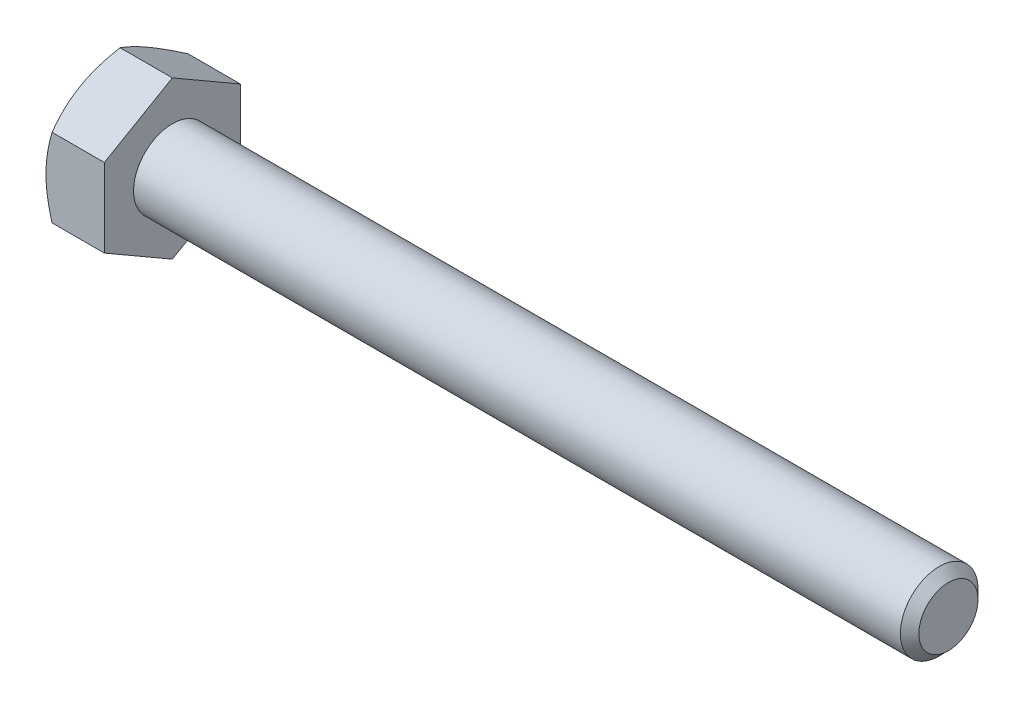
ISO-10303-21;
HEADER;
FILE_DESCRIPTION(('STEP AP214'),'2;1');
FILE_NAME('part.step','',(''),(''),'','','');
FILE_SCHEMA(('AUTOMOTIVE_DESIGN { 1 0 10303 214 1 1 1 1 }'));
ENDSEC;
DATA;
#1=APPLICATION_CONTEXT('core data for automotive mechanical design processes');
#2=APPLICATION_PROTOCOL_DEFINITION('international standard','automotive_design',2000,#1);
#3=PRODUCT_CONTEXT('',#1,'mechanical');
#4=PRODUCT('Part','Part','',(#3));
#5=PRODUCT_RELATED_PRODUCT_CATEGORY('part','',(#4));
#6=PRODUCT_DEFINITION_FORMATION('','',#4);
#7=PRODUCT_DEFINITION_CONTEXT('part definition',#1,'design');
#8=PRODUCT_DEFINITION('design','',#6,#7);
#9=PRODUCT_DEFINITION_SHAPE('','',#8);
#10=(LENGTH_UNIT() NAMED_UNIT(*) SI_UNIT(.MILLI.,.METRE.));
#11=(NAMED_UNIT(*) PLANE_ANGLE_UNIT() SI_UNIT($,.RADIAN.));
#12=(NAMED_UNIT(*) SI_UNIT($,.STERADIAN.) SOLID_ANGLE_UNIT());
#13=UNCERTAINTY_MEASURE_WITH_UNIT(LENGTH_MEASURE(1.E-05),#10,'distance_accuracy_value','');
#14=(GEOMETRIC_REPRESENTATION_CONTEXT(3) GLOBAL_UNCERTAINTY_ASSIGNED_CONTEXT((#13)) GLOBAL_UNIT_ASSIGNED_CONTEXT((#10,
#11,#12)) REPRESENTATION_CONTEXT('',''));
#15=CARTESIAN_POINT('',(0.,0.,0.));
#16=DIRECTION('',(0.,0.,1.));
#17=DIRECTION('',(1.,0.,0.));
#18=AXIS2_PLACEMENT_3D('',#15,#16,#17);
#19=CARTESIAN_POINT('',(4.7752,3.21156860739421,-5.5626));
#20=DIRECTION('',(0.,-0.866025403784438,0.500000000000001));
#21=DIRECTION('',(0.,-0.500000000000002,-0.866025403784438));
#22=AXIS2_PLACEMENT_3D('',#19,#20,#21);
#23=PLANE('',#22);
#24=CARTESIAN_POINT('',(0.496898061070145,6.42325268484227,0.0002));
#25=CARTESIAN_POINT('',(0.456146202255132,6.35265858120791,-0.122072574209491));
#26=CARTESIAN_POINT('',(0.417243775308724,6.2818012683745,-0.244801040124762));
#27=CARTESIAN_POINT('',(0.343647161560544,6.13951120287093,-0.491254662989244));
#28=CARTESIAN_POINT('',(0.308954790139046,6.06807821602766,-0.614980225538198));
#29=CARTESIAN_POINT('',(0.211873701066857,5.8526355064814,-0.988137944592621));
#30=CARTESIAN_POINT('',(0.156654841923374,5.70777535201369,-1.23904309212296));
#31=CARTESIAN_POINT('',(0.0919037861815295,5.49099476252076,-1.61451808721946));
#32=CARTESIAN_POINT('',(0.0734579983429358,5.419722058732,-1.7379660313744));
#33=CARTESIAN_POINT('',(0.0425268916674639,5.27685459691415,-1.98541973399132));
#34=CARTESIAN_POINT('',(0.03004104618901,5.20525986790489,-2.10942544218948));
#35=CARTESIAN_POINT('',(0.0113480299394723,5.06194605565758,-2.35765224642821));
#36=CARTESIAN_POINT('',(0.00513373340584859,4.9902272065059,-2.48187293701928));
#37=CARTESIAN_POINT('',(-0.000889599359094047,4.84672720555796,-2.7304222295473));
#38=CARTESIAN_POINT('',(-0.000698833448294769,4.7749460557547,-2.85475082803225));
#39=CARTESIAN_POINT('',(0.00862810136342433,4.57828637012706,-3.19537539533985));
#40=CARTESIAN_POINT('',(0.0242873955350771,4.4534722013835,-3.41155987710816));
#41=CARTESIAN_POINT('',(0.0739443233816063,4.20467287416474,-3.84249295274001));
#42=CARTESIAN_POINT('',(0.107958931423459,4.08068859075412,-4.05724003094723));
#43=CARTESIAN_POINT('',(0.192986041409677,3.83138850679899,-4.4890404426887));
#44=CARTESIAN_POINT('',(0.244358813937401,3.70610416511176,-4.70603928788379));
#45=CARTESIAN_POINT('',(0.360954456999594,3.45740388365365,-5.13680081122592));
#46=CARTESIAN_POINT('',(0.426149937617058,3.33398475856357,-5.35056900650764));
#47=CARTESIAN_POINT('',(0.496898061070138,3.21145313734037,-5.5628));
#48=B_SPLINE_CURVE_WITH_KNOTS('',3,(#24,#25,#26,#27,#28,#29,#30,#31,#32,#33,#34,#35,#36,#37,#38,
#39,#40,#41,#42,#43,#44,#45,#46,#47),.UNSPECIFIED.,.F.,.F.,(4,2,2,2,2,2,2,2,2,2,2,4),(0.,
0.440820118562271,0.881829648847401,1.76568130465017,2.19678242164486,2.62784543796583,
3.05841812523868,3.48897751176353,4.23854798324166,4.9888128227567,5.75571809391027,
6.52111769989992),.UNSPECIFIED.);
#49=CARTESIAN_POINT('',(0.49683139260579,6.42313721478843,0.));
#50=VERTEX_POINT('',#49);
#51=CARTESIAN_POINT('',(0.,4.81735291109131,-2.78130000000001));
#52=VERTEX_POINT('',#51);
#53=EDGE_CURVE('E47',#50,#52,#48,.T.);
#54=ORIENTED_EDGE('',*,*,#53,.F.);
#55=DIRECTION('',(-1.,0.,0.));
#56=VECTOR('',#55,1.);
#57=CARTESIAN_POINT('',(4.7752,6.42313721478843,0.));
#58=LINE('',#57,#56);
#59=CARTESIAN_POINT('',(4.7752,6.42313721478843,0.));
#60=VERTEX_POINT('',#59);
#61=EDGE_CURVE('E143',#60,#50,#58,.T.);
#62=ORIENTED_EDGE('',*,*,#61,.F.);
#63=DIRECTION('',(0.,0.500000000000001,0.866025403784438));
#64=VECTOR('',#63,1.);
#65=CARTESIAN_POINT('',(4.7752,3.21156860739421,-5.5626));
#66=LINE('',#65,#64);
#67=CARTESIAN_POINT('',(4.7752,3.21156860739421,-5.5626));
#68=VERTEX_POINT('',#67);
#69=EDGE_CURVE('E228',#68,#60,#66,.T.);
#70=ORIENTED_EDGE('',*,*,#69,.F.);
#71=DIRECTION('',(-1.,0.,0.));
#72=VECTOR('',#71,1.);
#73=CARTESIAN_POINT('',(4.7752,3.21156860739421,-5.5626));
#74=LINE('',#73,#72);
#75=CARTESIAN_POINT('',(0.496831392605783,3.21156860739421,-5.5626));
#76=VERTEX_POINT('',#75);
#77=EDGE_CURVE('E131',#68,#76,#74,.T.);
#78=ORIENTED_EDGE('',*,*,#77,.T.);
#79=EDGE_CURVE('E125',#52,#76,#48,.T.);
#80=ORIENTED_EDGE('',*,*,#79,.F.);
#81=EDGE_LOOP('',(#54,#62,#70,#78,#80));
#82=FACE_BOUND('',#81,.T.);
#83=ADVANCED_FACE('F31',(#82),#23,.F.);
#84=CARTESIAN_POINT('',(4.7752,6.42313721478843,0.));
#85=DIRECTION('',(0.,-0.866025403784438,-0.500000000000002));
#86=DIRECTION('',(0.,0.500000000000002,-0.866025403784438));
#87=AXIS2_PLACEMENT_3D('',#84,#85,#86);
#88=PLANE('',#87);
#89=CARTESIAN_POINT('',(0.496898061070137,3.21145313734037,5.5628));
#90=CARTESIAN_POINT('',(0.456146202255125,3.28204724097473,5.44052742579051));
#91=CARTESIAN_POINT('',(0.417243775308718,3.35290455380814,5.31779895987524));
#92=CARTESIAN_POINT('',(0.343647161560539,3.49519461931171,5.07134533701076));
#93=CARTESIAN_POINT('',(0.30895479013904,3.56662760615498,4.9476197744618));
#94=CARTESIAN_POINT('',(0.211873701066851,3.78207031570124,4.57446205540738));
#95=CARTESIAN_POINT('',(0.15665484192337,3.92693047016895,4.32355690787704));
#96=CARTESIAN_POINT('',(0.0919037861815258,4.14371105966188,3.94808191278055));
#97=CARTESIAN_POINT('',(0.0734579983429323,4.21498376345064,3.82463396862561));
#98=CARTESIAN_POINT('',(0.0425268916674611,4.35785122526849,3.57718026600868));
#99=CARTESIAN_POINT('',(0.0300410461890076,4.42944595427775,3.45317455781052));
#100=CARTESIAN_POINT('',(0.0113480299394705,4.57275976652506,3.20494775357179));
#101=CARTESIAN_POINT('',(0.00513373340584691,4.64447861567674,3.08072706298073));
#102=CARTESIAN_POINT('',(-0.000889599359095135,4.78797861662468,2.83217777045271));
#103=CARTESIAN_POINT('',(-0.000698833448295428,4.85975976642794,2.70784917196775));
#104=CARTESIAN_POINT('',(0.00862810136342448,5.05641945205558,2.36722460466016));
#105=CARTESIAN_POINT('',(0.0242873955350775,5.18123362079914,2.15104012289184));
#106=CARTESIAN_POINT('',(0.0739443233816076,5.4300329480179,1.72010704725999));
#107=CARTESIAN_POINT('',(0.107958931423461,5.55401723142852,1.50535996905278));
#108=CARTESIAN_POINT('',(0.192986041409681,5.80331731538366,1.0735595573113));
#109=CARTESIAN_POINT('',(0.244358813937406,5.92860165707088,0.856560712116214));
#110=CARTESIAN_POINT('',(0.360954456999599,6.17730193852899,0.425799188774085));
#111=CARTESIAN_POINT('',(0.426149937617065,6.30072106361907,0.212030993492364));
#112=CARTESIAN_POINT('',(0.496898061070145,6.42325268484227,-0.000200000000000452));
#113=B_SPLINE_CURVE_WITH_KNOTS('',3,(#89,#90,#91,#92,#93,#94,#95,#96,#97,#98,#99,#100,#101,#102,
#103,#104,#105,#106,#107,#108,#109,#110,#111,#112),.UNSPECIFIED.,.F.,.F.,(4,2,2,2,2,2,2,2,2,2,2,
4),(0.,0.440820118562269,0.881829648847399,1.76568130465016,2.19678242164486,2.62784543796583,
3.05841812523867,3.48897751176352,4.23854798324166,4.98881282275669,5.75571809391027,
6.52111769989993),.UNSPECIFIED.);
#114=CARTESIAN_POINT('',(0.496831392605783,3.21156860739421,5.5626));
#115=VERTEX_POINT('',#114);
#116=CARTESIAN_POINT('',(0.,4.81735291109131,2.78130000000001));
#117=VERTEX_POINT('',#116);
#118=EDGE_CURVE('E54',#115,#117,#113,.T.);
#119=ORIENTED_EDGE('',*,*,#118,.F.);
#120=DIRECTION('',(-1.,0.,0.));
#121=VECTOR('',#120,1.);
#122=CARTESIAN_POINT('',(4.7752,3.21156860739421,5.5626));
#123=LINE('',#122,#121);
#124=CARTESIAN_POINT('',(4.7752,3.21156860739421,5.5626));
#125=VERTEX_POINT('',#124);
#126=EDGE_CURVE('E141',#125,#115,#123,.T.);
#127=ORIENTED_EDGE('',*,*,#126,.F.);
#128=DIRECTION('',(0.,-0.500000000000002,0.866025403784438));
#129=VECTOR('',#128,1.);
#130=CARTESIAN_POINT('',(4.7752,6.42313721478843,0.));
#131=LINE('',#130,#129);
#132=EDGE_CURVE('E226',#60,#125,#131,.T.);
#133=ORIENTED_EDGE('',*,*,#132,.F.);
#134=ORIENTED_EDGE('',*,*,#61,.T.);
#135=EDGE_CURVE('E158',#117,#50,#113,.T.);
#136=ORIENTED_EDGE('',*,*,#135,.F.);
#137=EDGE_LOOP('',(#119,#127,#133,#134,#136));
#138=FACE_BOUND('',#137,.T.);
#139=ADVANCED_FACE('F164',(#138),#88,.F.);
#140=CARTESIAN_POINT('',(4.7752,3.21156860739421,5.5626));
#141=DIRECTION('',(0.,0.,-1.));
#142=DIRECTION('',(0.,1.,0.));
#143=AXIS2_PLACEMENT_3D('',#140,#141,#142);
#144=PLANE('',#143);
#145=CARTESIAN_POINT('',(2.76946298118782,-8.73931907134926,5.5626));
#146=CARTESIAN_POINT('',(2.65067477687311,-8.49536496294496,5.5626));
#147=CARTESIAN_POINT('',(2.53299354297042,-8.25086273134791,5.5626));
#148=CARTESIAN_POINT('',(2.30046552320843,-7.7604708971534,5.5626));
#149=CARTESIAN_POINT('',(2.18561916316987,-7.51458109286489,5.5626));
#150=CARTESIAN_POINT('',(1.95882765602869,-7.01990967591007,5.5626));
#151=CARTESIAN_POINT('',(1.8469007539214,-6.77111967039446,5.5626));
#152=CARTESIAN_POINT('',(1.62748022369642,-6.2715995272068,5.5626));
#153=CARTESIAN_POINT('',(1.51998639326666,-6.02086947869407,5.5626));
#154=CARTESIAN_POINT('',(1.30708686305049,-5.50862062515995,5.5626));
#155=CARTESIAN_POINT('',(1.2018721345633,-5.24702202730584,5.5626));
#156=CARTESIAN_POINT('',(0.999136458565238,-4.72080610690395,5.5626));
#157=CARTESIAN_POINT('',(0.901616358276672,-4.45618845560251,5.5626));
#158=CARTESIAN_POINT('',(0.716747076854938,-3.92397402586807,5.5626));
#159=CARTESIAN_POINT('',(0.629378259627776,-3.65638413416904,5.5626));
#160=CARTESIAN_POINT('',(0.467540995367502,-3.11736467394692,5.5626));
#161=CARTESIAN_POINT('',(0.393068603844484,-2.84593630702823,5.5626));
#162=CARTESIAN_POINT('',(0.260913640576687,-2.30059524037529,5.5626));
#163=CARTESIAN_POINT('',(0.203137923933969,-2.02670547196029,5.5626));
#164=CARTESIAN_POINT('',(0.107584140993962,-1.47536640605574,5.5626));
#165=CARTESIAN_POINT('',(0.0698039298235405,-1.19791749361908,5.5626));
#166=CARTESIAN_POINT('',(0.0306329033129829,-0.782024037078651,5.5626));
#167=CARTESIAN_POINT('',(0.0205033244370687,-0.644369603517899,5.5626));
#168=CARTESIAN_POINT('',(0.0060753924948423,-0.368760084714098,5.5626));
#169=CARTESIAN_POINT('',(0.00177648780683643,-0.230805029148983,5.5626));
#170=CARTESIAN_POINT('',(-0.00088241598890318,0.0451740110860491,5.5626));
#171=CARTESIAN_POINT('',(0.000758104200529116,0.183198000728104,5.5626));
#172=CARTESIAN_POINT('',(0.00993570123351545,0.459040077970908,5.5626));
#173=CARTESIAN_POINT('',(0.0174725517322426,0.596858173271942,5.5626));
#174=CARTESIAN_POINT('',(0.0422505226941699,0.924672766545149,5.5626));
#175=CARTESIAN_POINT('',(0.0620998981240967,1.11447655015001,5.5626));
#176=CARTESIAN_POINT('',(0.111925243451362,1.49274005777643,5.5626));
#177=CARTESIAN_POINT('',(0.141902492996073,1.68119960888146,5.5626));
#178=CARTESIAN_POINT('',(0.245441794558736,2.24430469004824,5.5626));
#179=CARTESIAN_POINT('',(0.3325951814541,2.61648783903803,5.5626));
#180=CARTESIAN_POINT('',(0.4845806566888,3.17327423069249,5.5626));
#181=CARTESIAN_POINT('',(0.539535147458612,3.36074033845109,5.5626));
#182=CARTESIAN_POINT('',(0.65536185695369,3.73385345225387,5.5626));
#183=CARTESIAN_POINT('',(0.716234120687406,3.91950044445069,5.5626));
#184=CARTESIAN_POINT('',(0.842902268347435,4.28903173945152,5.5626));
#185=CARTESIAN_POINT('',(0.908696733188397,4.47291653318727,5.5626));
#186=CARTESIAN_POINT('',(1.04441413237549,4.83914664715104,5.5626));
#187=CARTESIAN_POINT('',(1.11433697604312,5.02149200109189,5.5626));
#188=CARTESIAN_POINT('',(1.30616254116174,5.5078879993683,5.5626));
#189=CARTESIAN_POINT('',(1.43118964217263,5.81070521732177,5.5626));
#190=CARTESIAN_POINT('',(1.68847909791363,6.41326146392027,5.5626));
#191=CARTESIAN_POINT('',(1.82074222334613,6.7130001606208,5.5626));
#192=CARTESIAN_POINT('',(2.09080854329268,7.31009692856944,5.5626));
#193=CARTESIAN_POINT('',(2.22861377416229,7.60745407573435,5.5626));
#194=CARTESIAN_POINT('',(2.50845292532567,8.20015103027085,5.5626));
#195=CARTESIAN_POINT('',(2.65048668069894,8.4954909157686,5.5626));
#196=CARTESIAN_POINT('',(2.93809441051761,9.08501121024942,5.5626));
#197=CARTESIAN_POINT('',(3.08367358024025,9.37918907947537,5.5626));
#198=CARTESIAN_POINT('',(3.3774807874048,9.96621951539326,5.5626));
#199=CARTESIAN_POINT('',(3.52570884593012,10.2590720715133,5.5626));
#200=CARTESIAN_POINT('',(3.97349977739061,11.135883002068,5.5626));
#201=CARTESIAN_POINT('',(4.27623214013078,11.7182219913801,5.5626));
#202=CARTESIAN_POINT('',(4.85550678061973,12.8193647778852,5.5626));
#203=CARTESIAN_POINT('',(5.131489866857,13.3384641726992,5.5626));
#204=CARTESIAN_POINT('',(5.68680572725548,14.3749069841369,5.5626));
#205=CARTESIAN_POINT('',(5.96613869990832,14.8922502943533,5.5626));
#206=CARTESIAN_POINT('',(6.52636532569115,15.9238879354022,5.5626));
#207=CARTESIAN_POINT('',(6.80725082971984,16.438186698545,5.5626));
#208=CARTESIAN_POINT('',(7.37092859091901,17.4656872159849,5.5626));
#209=CARTESIAN_POINT('',(7.65372069975336,17.9788890516247,5.5626));
#210=CARTESIAN_POINT('',(7.93720779447483,18.4917042756102,5.5626));
#211=B_SPLINE_CURVE_WITH_KNOTS('',3,(#145,#146,#147,#148,#149,#150,#151,#152,#153,#154,#155,
#156,#157,#158,#159,#160,#161,#162,#163,#164,#165,#166,#167,#168,#169,#170,#171,#172,#173,#174,
#175,#176,#177,#178,#179,#180,#181,#182,#183,#184,#185,#186,#187,#188,#189,#190,#191,#192,#193,
#194,#195,#196,#197,#198,#199,#200,#201,#202,#203,#204,#205,#206,#207,#208,#209,#210),
.UNSPECIFIED.,.F.,.F.,(4,2,2,2,2,2,2,2,2,2,2,2,2,2,2,2,2,2,2,2,2,2,2,2,2,2,2,2,2,2,2,2,4),(0.,
0.814023059457575,1.62816765666496,2.44655638570204,3.26490772451191,4.1107076400708,
4.95660055342857,5.80082897227975,6.64479871831149,7.4839651145243,8.32304147698214,
8.73701667946676,9.15095271433074,9.56492494141957,9.97888127796806,10.5510771655991,
11.1233453766966,12.2684477407956,12.8544603586944,13.4404774339429,14.0263262050101,
14.6121621128824,15.5948602729038,16.577663303757,17.5608308091096,18.5439600191606,
19.5286286861599,20.5133051939663,22.4822323595086,24.2459312012703,26.0097350693916,
27.7677407284946,29.5256111556824),.UNSPECIFIED.);
#212=CARTESIAN_POINT('',(0.496831392605776,-3.21156860739418,5.5626));
#213=VERTEX_POINT('',#212);
#214=CARTESIAN_POINT('',(0.,0.,5.5626));
#215=VERTEX_POINT('',#214);
#216=EDGE_CURVE('E238',#213,#215,#211,.T.);
#217=ORIENTED_EDGE('',*,*,#216,.F.);
#218=DIRECTION('',(-1.,0.,0.));
#219=VECTOR('',#218,1.);
#220=CARTESIAN_POINT('',(4.7752,-3.21156860739418,5.5626));
#221=LINE('',#220,#219);
#222=CARTESIAN_POINT('',(4.7752,-3.21156860739418,5.5626));
#223=VERTEX_POINT('',#222);
#224=EDGE_CURVE('E133',#223,#213,#221,.T.);
#225=ORIENTED_EDGE('',*,*,#224,.F.);
#226=DIRECTION('',(0.,-1.,0.));
#227=VECTOR('',#226,1.);
#228=CARTESIAN_POINT('',(4.7752,3.21156860739421,5.5626));
#229=LINE('',#228,#227);
#230=EDGE_CURVE('E222',#125,#223,#229,.T.);
#231=ORIENTED_EDGE('',*,*,#230,.F.);
#232=ORIENTED_EDGE('',*,*,#126,.T.);
#233=EDGE_CURVE('E180',#215,#115,#211,.T.);
#234=ORIENTED_EDGE('',*,*,#233,.F.);
#235=EDGE_LOOP('',(#217,#225,#231,#232,#234));
#236=FACE_BOUND('',#235,.T.);
#237=ADVANCED_FACE('F244',(#236),#144,.F.);
#238=CARTESIAN_POINT('',(4.7752,-6.42313721478841,0.));
#239=DIRECTION('',(0.,0.866025403784438,-0.500000000000002));
#240=DIRECTION('',(0.,0.500000000000002,0.866025403784438));
#241=AXIS2_PLACEMENT_3D('',#238,#239,#240);
#242=PLANE('',#241);
#243=CARTESIAN_POINT('',(0.496898061070133,-6.42325268484225,-0.000200000000000067));
#244=CARTESIAN_POINT('',(0.45614620225512,-6.35265858120789,0.12207257420949));
#245=CARTESIAN_POINT('',(0.417243775308713,-6.28180126837448,0.244801040124761));
#246=CARTESIAN_POINT('',(0.343647161560533,-6.13951120287091,0.491254662989242));
#247=CARTESIAN_POINT('',(0.308954790139034,-6.06807821602764,0.614980225538195));
#248=CARTESIAN_POINT('',(0.211873701066845,-5.85263550648138,0.988137944592617));
#249=CARTESIAN_POINT('',(0.156654841923363,-5.70777535201367,1.23904309212296));
#250=CARTESIAN_POINT('',(0.0919037861815182,-5.49099476252074,1.61451808721945));
#251=CARTESIAN_POINT('',(0.0734579983429243,-5.41972205873198,1.73796603137439));
#252=CARTESIAN_POINT('',(0.0425268916674522,-5.27685459691413,1.98541973399131));
#253=CARTESIAN_POINT('',(0.0300410461889981,-5.20525986790487,2.10942544218947));
#254=CARTESIAN_POINT('',(0.0113480299394605,-5.06194605565756,2.3576522464282));
#255=CARTESIAN_POINT('',(0.00513373340583685,-4.99022720650589,2.48187293701927));
#256=CARTESIAN_POINT('',(-0.000889599359105341,-4.84672720555794,2.73042222954729));
#257=CARTESIAN_POINT('',(-0.000698833448305768,-4.77494605575468,2.85475082803224));
#258=CARTESIAN_POINT('',(0.00862810136341335,-4.57828637012704,3.19537539533984));
#259=CARTESIAN_POINT('',(0.0242873955350654,-4.45347220138349,3.41155987710815));
#260=CARTESIAN_POINT('',(0.0739443233815945,-4.20467287416472,3.84249295274001));
#261=CARTESIAN_POINT('',(0.107958931423448,-4.0806885907541,4.05724003094722));
#262=CARTESIAN_POINT('',(0.192986041409668,-3.83138850679897,4.48904044268869));
#263=CARTESIAN_POINT('',(0.244358813937392,-3.70610416511174,4.70603928788378));
#264=CARTESIAN_POINT('',(0.360954456999586,-3.45740388365363,5.13680081122591));
#265=CARTESIAN_POINT('',(0.426149937617051,-3.33398475856355,5.35056900650764));
#266=CARTESIAN_POINT('',(0.49689806107013,-3.21145313734035,5.5628));
#267=B_SPLINE_CURVE_WITH_KNOTS('',3,(#243,#244,#245,#246,#247,#248,#249,#250,#251,#252,#253,
#254,#255,#256,#257,#258,#259,#260,#261,#262,#263,#264,#265,#266),.UNSPECIFIED.,.F.,.F.,(4,2,2,
2,2,2,2,2,2,2,2,4),(0.,0.440820118562269,0.881829648847397,1.76568130465016,2.19678242164486,
2.62784543796582,3.05841812523867,3.48897751176352,4.23854798324165,4.98881282275669,
5.75571809391027,6.52111769989993),.UNSPECIFIED.);
#268=CARTESIAN_POINT('',(0.496831392605778,-6.42313721478841,0.));
#269=VERTEX_POINT('',#268);
#270=CARTESIAN_POINT('',(0.,-4.81735291109131,2.78130000000001));
#271=VERTEX_POINT('',#270);
#272=EDGE_CURVE('E166',#269,#271,#267,.T.);
#273=ORIENTED_EDGE('',*,*,#272,.F.);
#274=DIRECTION('',(-1.,0.,0.));
#275=VECTOR('',#274,1.);
#276=CARTESIAN_POINT('',(4.7752,-6.42313721478841,0.));
#277=LINE('',#276,#275);
#278=CARTESIAN_POINT('',(4.7752,-6.42313721478841,0.));
#279=VERTEX_POINT('',#278);
#280=EDGE_CURVE('E130',#279,#269,#277,.T.);
#281=ORIENTED_EDGE('',*,*,#280,.F.);
#282=DIRECTION('',(0.,-0.500000000000002,-0.866025403784438));
#283=VECTOR('',#282,1.);
#284=CARTESIAN_POINT('',(4.7752,-6.42313721478841,0.));
#285=LINE('',#284,#283);
#286=EDGE_CURVE('E220',#223,#279,#285,.T.);
#287=ORIENTED_EDGE('',*,*,#286,.F.);
#288=ORIENTED_EDGE('',*,*,#224,.T.);
#289=EDGE_CURVE('E168',#271,#213,#267,.T.);
#290=ORIENTED_EDGE('',*,*,#289,.F.);
#291=EDGE_LOOP('',(#273,#281,#287,#288,#290));
#292=FACE_BOUND('',#291,.T.);
#293=ADVANCED_FACE('F216',(#292),#242,.F.);
#294=CARTESIAN_POINT('',(4.7752,-3.21156860739421,-5.5626));
#295=DIRECTION('',(0.,0.866025403784439,0.499999999999999));
#296=DIRECTION('',(0.,-0.499999999999999,0.866025403784439));
#297=AXIS2_PLACEMENT_3D('',#294,#295,#296);
#298=PLANE('',#297);
#299=CARTESIAN_POINT('',(0.496898061070139,-3.21145313734037,-5.5628));
#300=CARTESIAN_POINT('',(0.456146202255127,-3.28204724097473,-5.44052742579051));
#301=CARTESIAN_POINT('',(0.417243775308719,-3.35290455380814,-5.31779895987524));
#302=CARTESIAN_POINT('',(0.343647161560539,-3.49519461931171,-5.07134533701076));
#303=CARTESIAN_POINT('',(0.30895479013904,-3.56662760615499,-4.9476197744618));
#304=CARTESIAN_POINT('',(0.211873701066851,-3.78207031570124,-4.57446205540738));
#305=CARTESIAN_POINT('',(0.15665484192337,-3.92693047016895,-4.32355690787704));
#306=CARTESIAN_POINT('',(0.0919037861815247,-4.14371105966188,-3.94808191278054));
#307=CARTESIAN_POINT('',(0.0734579983429302,-4.21498376345064,-3.8246339686256));
#308=CARTESIAN_POINT('',(0.0425268916674584,-4.35785122526849,-3.57718026600868));
#309=CARTESIAN_POINT('',(0.0300410461890051,-4.42944595427775,-3.45317455781052));
#310=CARTESIAN_POINT('',(0.0113480299394679,-4.57275976652506,-3.20494775357179));
#311=CARTESIAN_POINT('',(0.00513373340584384,-4.64447861567673,-3.08072706298072));
#312=CARTESIAN_POINT('',(-0.000889599359098822,-4.78797861662468,-2.8321777704527));
#313=CARTESIAN_POINT('',(-0.00069883344829927,-4.85975976642793,-2.70784917196775));
#314=CARTESIAN_POINT('',(0.00862810136342017,-5.05641945205557,-2.36722460466015));
#315=CARTESIAN_POINT('',(0.0242873955350727,-5.18123362079913,-2.15104012289184));
#316=CARTESIAN_POINT('',(0.073944323381602,-5.43003294801789,-1.72010704725998));
#317=CARTESIAN_POINT('',(0.107958931423455,-5.55401723142851,-1.50535996905277));
#318=CARTESIAN_POINT('',(0.192986041409674,-5.80331731538364,-1.0735595573113));
#319=CARTESIAN_POINT('',(0.244358813937398,-5.92860165707086,-0.856560712116212));
#320=CARTESIAN_POINT('',(0.36095445699959,-6.17730193852897,-0.425799188774083));
#321=CARTESIAN_POINT('',(0.426149937617054,-6.30072106361906,-0.212030993492363));
#322=CARTESIAN_POINT('',(0.496898061070133,-6.42325268484225,0.000200000000000195));
#323=B_SPLINE_CURVE_WITH_KNOTS('',3,(#299,#300,#301,#302,#303,#304,#305,#306,#307,#308,#309,
#310,#311,#312,#313,#314,#315,#316,#317,#318,#319,#320,#321,#322),.UNSPECIFIED.,.F.,.F.,(4,2,2,
2,2,2,2,2,2,2,2,4),(0.,0.44082011856227,0.881829648847399,1.76568130465016,2.19678242164486,
2.62784543796583,3.05841812523868,3.48897751176352,4.23854798324166,4.98881282275669,
5.75571809391027,6.52111769989992),.UNSPECIFIED.);
#324=CARTESIAN_POINT('',(0.496831392605575,-3.21156860739453,-5.5626));
#325=VERTEX_POINT('',#324);
#326=CARTESIAN_POINT('',(0.,-4.81735291109132,-2.78129999999999));
#327=VERTEX_POINT('',#326);
#328=EDGE_CURVE('E107',#325,#327,#323,.T.);
#329=ORIENTED_EDGE('',*,*,#328,.F.);
#330=DIRECTION('',(-1.,0.,0.));
#331=VECTOR('',#330,1.);
#332=CARTESIAN_POINT('',(4.7752,-3.21156860739421,-5.5626));
#333=LINE('',#332,#331);
#334=CARTESIAN_POINT('',(4.7752,-3.21156860739421,-5.5626));
#335=VERTEX_POINT('',#334);
#336=EDGE_CURVE('E121',#335,#325,#333,.T.);
#337=ORIENTED_EDGE('',*,*,#336,.F.);
#338=DIRECTION('',(0.,0.499999999999999,-0.866025403784439));
#339=VECTOR('',#338,1.);
#340=CARTESIAN_POINT('',(4.7752,-3.21156860739421,-5.5626));
#341=LINE('',#340,#339);
#342=EDGE_CURVE('E218',#279,#335,#341,.T.);
#343=ORIENTED_EDGE('',*,*,#342,.F.);
#344=ORIENTED_EDGE('',*,*,#280,.T.);
#345=EDGE_CURVE('E124',#327,#269,#323,.T.);
#346=ORIENTED_EDGE('',*,*,#345,.F.);
#347=EDGE_LOOP('',(#329,#337,#343,#344,#346));
#348=FACE_BOUND('',#347,.T.);
#349=ADVANCED_FACE('F119',(#348),#298,.F.);
#350=CARTESIAN_POINT('',(4.7752,3.21156860739421,-5.5626));
#351=DIRECTION('',(0.,0.,1.));
#352=DIRECTION('',(0.,-1.,0.));
#353=AXIS2_PLACEMENT_3D('',#350,#351,#352);
#354=PLANE('',#353);
#355=CARTESIAN_POINT('',(2.76946298300579,-8.73931907508182,-5.5626));
#356=CARTESIAN_POINT('',(2.65067477861528,-8.49536496655187,-5.5626));
#357=CARTESIAN_POINT('',(2.53299354463683,-8.25086273482909,-5.5626));
#358=CARTESIAN_POINT('',(2.30046552472368,-7.76047090038272,-5.5626));
#359=CARTESIAN_POINT('',(2.18561916460972,-7.51458109596809,-5.5626));
#360=CARTESIAN_POINT('',(1.95882765731771,-7.01990967875913,-5.5626));
#361=CARTESIAN_POINT('',(1.846900755135,-6.77111967311548,-5.5626));
#362=CARTESIAN_POINT('',(1.62748022476042,-6.27159952967088,-5.5626));
#363=CARTESIAN_POINT('',(1.51998639425648,-6.02086948102925,-5.5626));
#364=CARTESIAN_POINT('',(1.30708686388975,-5.50862062722724,-5.5626));
#365=CARTESIAN_POINT('',(1.20187213532635,-5.24702202923405,-5.5626));
#366=CARTESIAN_POINT('',(0.99913645917992,-4.72080610855178,-5.5626));
#367=CARTESIAN_POINT('',(0.901616358819191,-4.45618845710904,-5.5626));
#368=CARTESIAN_POINT('',(0.716747077259988,-3.92397402708937,-5.5626));
#369=CARTESIAN_POINT('',(0.629378259967501,-3.65638413524644,-5.5626));
#370=CARTESIAN_POINT('',(0.467540995587167,-3.11736467473259,-5.5626));
#371=CARTESIAN_POINT('',(0.393068604009408,-2.84593630766609,-5.5626));
#372=CARTESIAN_POINT('',(0.260913640631061,-2.3005952406421,-5.5626));
#373=CARTESIAN_POINT('',(0.203137923936715,-2.02670547200285,-5.5626));
#374=CARTESIAN_POINT('',(0.107584140927261,-1.47536640564425,-5.5626));
#375=CARTESIAN_POINT('',(0.0698039297389958,-1.19791749297779,-5.5626));
#376=CARTESIAN_POINT('',(0.0306329032322217,-0.782024036094227,-5.5626));
#377=CARTESIAN_POINT('',(0.0205033243625259,-0.644369602420758,-5.5626));
#378=CARTESIAN_POINT('',(0.00607539244269881,-0.368760083391737,-5.5626));
#379=CARTESIAN_POINT('',(0.00177648777087203,-0.230805027714118,-5.5626));
#380=CARTESIAN_POINT('',(-0.000882415982739008,0.0451740127451212,-5.5626));
#381=CARTESIAN_POINT('',(0.000758104232646094,0.183198002498879,-5.5626));
#382=CARTESIAN_POINT('',(0.00993570132662366,0.459040079963616,-5.5626));
#383=CARTESIAN_POINT('',(0.0174725518603885,0.596858175374882,-5.5626));
#384=CARTESIAN_POINT('',(0.042250522908457,0.924672768817533,-5.5626));
#385=CARTESIAN_POINT('',(0.062099898387905,1.11447655248113,-5.5626));
#386=CARTESIAN_POINT('',(0.11192524381685,1.49274006022233,-5.5626));
#387=CARTESIAN_POINT('',(0.14190249341372,1.68119961138341,-5.5626));
#388=CARTESIAN_POINT('',(0.245441795133937,2.24430469271527,-5.5626));
#389=CARTESIAN_POINT('',(0.332595182135703,2.61648784181074,-5.5626));
#390=CARTESIAN_POINT('',(0.484580657527371,3.17327423362326,-5.5626));
#391=CARTESIAN_POINT('',(0.539535148349866,3.36074034143568,-5.5626));
#392=CARTESIAN_POINT('',(0.65536185794868,3.73385345534551,-5.5626));
#393=CARTESIAN_POINT('',(0.71623412173345,3.91950044759555,-5.5626));
#394=CARTESIAN_POINT('',(0.842902269493737,4.28903174270241,-5.5626));
#395=CARTESIAN_POINT('',(0.908696734383901,4.47291653649097,-5.5626));
#396=CARTESIAN_POINT('',(1.04441413366767,4.83914665056039,-5.5626));
#397=CARTESIAN_POINT('',(1.11433697738277,5.02149200455406,-5.5626));
#398=CARTESIAN_POINT('',(1.30616254258248,5.5078880028608,-5.5626));
#399=CARTESIAN_POINT('',(1.43118964362202,5.8107052207933,-5.5626));
#400=CARTESIAN_POINT('',(1.68847909941208,6.41326146735255,-5.5626));
#401=CARTESIAN_POINT('',(1.82074222486501,6.71300016403479,-5.5626));
#402=CARTESIAN_POINT('',(2.09080854484644,7.31009693194882,-5.5626));
#403=CARTESIAN_POINT('',(2.22861377573049,7.60745407909739,-5.5626));
#404=CARTESIAN_POINT('',(2.50845292691854,8.20015103360299,-5.5626));
#405=CARTESIAN_POINT('',(2.65048668230202,8.49549091908616,-5.5626));
#406=CARTESIAN_POINT('',(2.93809441213761,9.08501121353829,-5.5626));
#407=CARTESIAN_POINT('',(3.08367358186692,9.37918908275012,-5.5626));
#408=CARTESIAN_POINT('',(3.37748078904248,9.96621951864084,-5.5626));
#409=CARTESIAN_POINT('',(3.52570884757214,10.2590720747479,-5.5626));
#410=CARTESIAN_POINT('',(3.97349977904316,11.1358830052649,-5.5626));
#411=CARTESIAN_POINT('',(4.27623214178692,11.7182219945536,-5.5626));
#412=CARTESIAN_POINT('',(4.85550678228881,12.8193647810355,-5.5626));
#413=CARTESIAN_POINT('',(5.13148986853601,13.3384641758492,-5.5626));
#414=CARTESIAN_POINT('',(5.68680572895232,14.3749069872875,-5.5626));
#415=CARTESIAN_POINT('',(5.96613870161306,14.8922502975047,-5.5626));
#416=CARTESIAN_POINT('',(6.52636532741208,15.9238879385591,-5.5626));
#417=CARTESIAN_POINT('',(6.80725083144907,16.4381867017065,-5.5626));
#418=CARTESIAN_POINT('',(7.37092859266394,17.4656872191565,-5.5626));
#419=CARTESIAN_POINT('',(7.65372070150567,17.9788890548015,-5.5626));
#420=CARTESIAN_POINT('',(7.93720779623423,18.4917042787924,-5.5626));
#421=B_SPLINE_CURVE_WITH_KNOTS('',3,(#355,#356,#357,#358,#359,#360,#361,#362,#363,#364,#365,
#366,#367,#368,#369,#370,#371,#372,#373,#374,#375,#376,#377,#378,#379,#380,#381,#382,#383,#384,
#385,#386,#387,#388,#389,#390,#391,#392,#393,#394,#395,#396,#397,#398,#399,#400,#401,#402,#403,
#404,#405,#406,#407,#408,#409,#410,#411,#412,#413,#414,#415,#416,#417,#418,#419,#420),
.UNSPECIFIED.,.F.,.F.,(4,2,2,2,2,2,2,2,2,2,2,2,2,2,2,2,2,2,2,2,2,2,2,2,2,2,2,2,2,2,2,2,4),(0.,
0.814023059896039,1.62816765754195,2.44655638702216,3.26490772627512,4.11070764230638,
4.95660055613668,5.80082897545884,6.6447987219612,7.48396511886283,8.32304148200849,
8.7370166848287,9.15095272002818,9.56492494745272,9.97888128433687,10.5510771721585,
11.1233453834466,12.2684477479276,12.8544603660259,13.4404774414739,14.0263262127401,
14.6121621208114,15.5948602808078,16.5776633116356,17.5608308169621,18.5439600269871,
19.5286286939573,20.5133052017346,22.4822323672198,24.245931208995,26.0097350771296,
27.7677407362569,29.5256111634693),.UNSPECIFIED.);
#422=CARTESIAN_POINT('',(0.,0.,-5.5626));
#423=VERTEX_POINT('',#422);
#424=EDGE_CURVE('E113',#76,#423,#421,.F.);
#425=ORIENTED_EDGE('',*,*,#424,.F.);
#426=ORIENTED_EDGE('',*,*,#77,.F.);
#427=DIRECTION('',(0.,1.,0.));
#428=VECTOR('',#427,1.);
#429=CARTESIAN_POINT('',(4.7752,3.21156860739421,-5.5626));
#430=LINE('',#429,#428);
#431=EDGE_CURVE('E129',#335,#68,#430,.T.);
#432=ORIENTED_EDGE('',*,*,#431,.F.);
#433=ORIENTED_EDGE('',*,*,#336,.T.);
#434=EDGE_CURVE('E104',#423,#325,#421,.F.);
#435=ORIENTED_EDGE('',*,*,#434,.F.);
#436=EDGE_LOOP('',(#425,#426,#432,#433,#435));
#437=FACE_BOUND('',#436,.T.);
#438=ADVANCED_FACE('F127',(#437),#354,.F.);
#439=CARTESIAN_POINT('',(4.7752,6.42313721478843,0.));
#440=DIRECTION('',(1.,0.,0.));
#441=DIRECTION('',(0.,0.,-1.));
#442=AXIS2_PLACEMENT_3D('',#439,#440,#441);
#443=PLANE('',#442);
#444=ORIENTED_EDGE('',*,*,#69,.T.);
#445=ORIENTED_EDGE('',*,*,#132,.T.);
#446=ORIENTED_EDGE('',*,*,#230,.T.);
#447=ORIENTED_EDGE('',*,*,#286,.T.);
#448=ORIENTED_EDGE('',*,*,#342,.T.);
#449=ORIENTED_EDGE('',*,*,#431,.T.);
#450=EDGE_LOOP('',(#444,#445,#446,#447,#448,#449));
#451=FACE_BOUND('',#450,.T.);
#452=CARTESIAN_POINT('',(4.7752,0.,0.));
#453=DIRECTION('',(1.,0.,0.));
#454=DIRECTION('',(0.,0.,-1.));
#455=AXIS2_PLACEMENT_3D('',#452,#453,#454);
#456=CIRCLE('',#455,3.175);
#457=CARTESIAN_POINT('',(4.7752,0.,-3.175));
#458=VERTEX_POINT('',#457);
#459=EDGE_CURVE('E231',#458,#458,#456,.F.);
#460=ORIENTED_EDGE('',*,*,#459,.T.);
#461=EDGE_LOOP('',(#460));
#462=FACE_BOUND('',#461,.T.);
#463=ADVANCED_FACE('F246',(#451,#462),#443,.T.);
#464=CARTESIAN_POINT('',(0.,0.,0.));
#465=DIRECTION('',(-1.,0.,0.));
#466=DIRECTION('',(0.,0.,1.));
#467=AXIS2_PLACEMENT_3D('',#464,#465,#466);
#468=CYLINDRICAL_SURFACE('',#467,3.175);
#469=ORIENTED_EDGE('',*,*,#459,.F.);
#470=EDGE_LOOP('',(#469));
#471=FACE_BOUND('',#470,.T.);
#472=CARTESIAN_POINT('',(67.51955,0.,0.));
#473=DIRECTION('',(-1.,0.,0.));
#474=DIRECTION('',(0.,0.,1.));
#475=AXIS2_PLACEMENT_3D('',#472,#473,#474);
#476=CIRCLE('',#475,3.175);
#477=CARTESIAN_POINT('',(67.51955,0.,3.175));
#478=VERTEX_POINT('',#477);
#479=EDGE_CURVE('E234',#478,#478,#476,.T.);
#480=ORIENTED_EDGE('',*,*,#479,.T.);
#481=EDGE_LOOP('',(#480));
#482=FACE_BOUND('',#481,.T.);
#483=ADVANCED_FACE('F278',(#471,#482),#468,.T.);
#484=CARTESIAN_POINT('',(68.2752,0.,0.));
#485=DIRECTION('',(-1.,0.,0.));
#486=DIRECTION('',(0.,0.,1.));
#487=AXIS2_PLACEMENT_3D('',#484,#485,#486);
#488=CONICAL_SURFACE('',#487,2.41935,0.785398163397432);
#489=ORIENTED_EDGE('',*,*,#479,.F.);
#490=EDGE_LOOP('',(#489));
#491=FACE_BOUND('',#490,.T.);
#492=CARTESIAN_POINT('',(68.2752,0.,0.));
#493=DIRECTION('',(-1.,0.,0.));
#494=DIRECTION('',(0.,0.,1.));
#495=AXIS2_PLACEMENT_3D('',#492,#493,#494);
#496=CIRCLE('',#495,2.41935);
#497=CARTESIAN_POINT('',(68.2752,0.,2.41935));
#498=VERTEX_POINT('',#497);
#499=EDGE_CURVE('E236',#498,#498,#496,.T.);
#500=ORIENTED_EDGE('',*,*,#499,.T.);
#501=EDGE_LOOP('',(#500));
#502=FACE_BOUND('',#501,.T.);
#503=ADVANCED_FACE('F280',(#491,#502),#488,.T.);
#504=CARTESIAN_POINT('',(68.2752,0.,0.));
#505=DIRECTION('',(-1.,0.,0.));
#506=DIRECTION('',(0.,0.,1.));
#507=AXIS2_PLACEMENT_3D('',#504,#505,#506);
#508=PLANE('',#507);
#509=ORIENTED_EDGE('',*,*,#499,.F.);
#510=EDGE_LOOP('',(#509));
#511=FACE_BOUND('',#510,.T.);
#512=ADVANCED_FACE('F193',(#511),#508,.F.);
#513=CARTESIAN_POINT('',(0.,0.,0.));
#514=DIRECTION('',(1.,0.,0.));
#515=DIRECTION('',(0.,0.,-1.));
#516=AXIS2_PLACEMENT_3D('',#513,#514,#515);
#517=CONICAL_SURFACE('',#516,5.5626,1.0471975511966);
#518=ORIENTED_EDGE('',*,*,#328,.T.);
#519=CARTESIAN_POINT('',(0.,0.,0.));
#520=DIRECTION('',(1.,0.,0.));
#521=DIRECTION('',(0.,0.,-1.));
#522=AXIS2_PLACEMENT_3D('',#519,#520,#521);
#523=CIRCLE('',#522,5.5626);
#524=EDGE_CURVE('E35',#327,#423,#523,.T.);
#525=ORIENTED_EDGE('',*,*,#524,.T.);
#526=ORIENTED_EDGE('',*,*,#434,.T.);
#527=EDGE_LOOP('',(#518,#525,#526));
#528=FACE_BOUND('',#527,.T.);
#529=ADVANCED_FACE('F106',(#528),#517,.T.);
#530=ORIENTED_EDGE('',*,*,#272,.T.);
#531=EDGE_CURVE('E148',#271,#327,#523,.T.);
#532=ORIENTED_EDGE('',*,*,#531,.T.);
#533=ORIENTED_EDGE('',*,*,#345,.T.);
#534=EDGE_LOOP('',(#530,#532,#533));
#535=FACE_BOUND('',#534,.T.);
#536=ADVANCED_FACE('F192',(#535),#517,.T.);
#537=ORIENTED_EDGE('',*,*,#216,.T.);
#538=EDGE_CURVE('E149',#215,#271,#523,.T.);
#539=ORIENTED_EDGE('',*,*,#538,.T.);
#540=ORIENTED_EDGE('',*,*,#289,.T.);
#541=EDGE_LOOP('',(#537,#539,#540));
#542=FACE_BOUND('',#541,.T.);
#543=ADVANCED_FACE('F187',(#542),#517,.T.);
#544=ORIENTED_EDGE('',*,*,#233,.T.);
#545=ORIENTED_EDGE('',*,*,#118,.T.);
#546=CARTESIAN_POINT('',(0.,0.,0.));
#547=DIRECTION('',(-1.,0.,0.));
#548=DIRECTION('',(0.,0.,1.));
#549=AXIS2_PLACEMENT_3D('',#546,#547,#548);
#550=CIRCLE('',#549,5.5626);
#551=EDGE_CURVE('E114',#215,#117,#550,.T.);
#552=ORIENTED_EDGE('',*,*,#551,.F.);
#553=EDGE_LOOP('',(#544,#545,#552));
#554=FACE_BOUND('',#553,.T.);
#555=ADVANCED_FACE('F191',(#554),#517,.T.);
#556=ORIENTED_EDGE('',*,*,#135,.T.);
#557=ORIENTED_EDGE('',*,*,#53,.T.);
#558=EDGE_CURVE('E40',#52,#117,#523,.T.);
#559=ORIENTED_EDGE('',*,*,#558,.T.);
#560=EDGE_LOOP('',(#556,#557,#559));
#561=FACE_BOUND('',#560,.T.);
#562=ADVANCED_FACE('F157',(#561),#517,.T.);
#563=ORIENTED_EDGE('',*,*,#79,.T.);
#564=ORIENTED_EDGE('',*,*,#424,.T.);
#565=EDGE_CURVE('E11',#423,#52,#523,.T.);
#566=ORIENTED_EDGE('',*,*,#565,.T.);
#567=EDGE_LOOP('',(#563,#564,#566));
#568=FACE_BOUND('',#567,.T.);
#569=ADVANCED_FACE('F250',(#568),#517,.T.);
#570=CARTESIAN_POINT('',(0.,6.42313721478843,0.));
#571=DIRECTION('',(1.,0.,0.));
#572=DIRECTION('',(0.,0.,-1.));
#573=AXIS2_PLACEMENT_3D('',#570,#571,#572);
#574=PLANE('',#573);
#575=ORIENTED_EDGE('',*,*,#565,.F.);
#576=ORIENTED_EDGE('',*,*,#524,.F.);
#577=ORIENTED_EDGE('',*,*,#531,.F.);
#578=ORIENTED_EDGE('',*,*,#538,.F.);
#579=ORIENTED_EDGE('',*,*,#551,.T.);
#580=ORIENTED_EDGE('',*,*,#558,.F.);
#581=EDGE_LOOP('',(#575,#576,#577,#578,#579,#580));
#582=FACE_BOUND('',#581,.T.);
#583=ADVANCED_FACE('F161',(#582),#574,.F.);
#584=CLOSED_SHELL('',(#83,#139,#237,#293,#349,#438,#463,#483,#503,#512,#529,#536,#543,#555,#562,
#569,#583));
#585=MANIFOLD_SOLID_BREP('B2',#584);
#586=ADVANCED_BREP_SHAPE_REPRESENTATION('',(#18,#585),#14);
#587=SHAPE_DEFINITION_REPRESENTATION(#9,#586);
ENDSEC;
END-ISO-10303-21;
